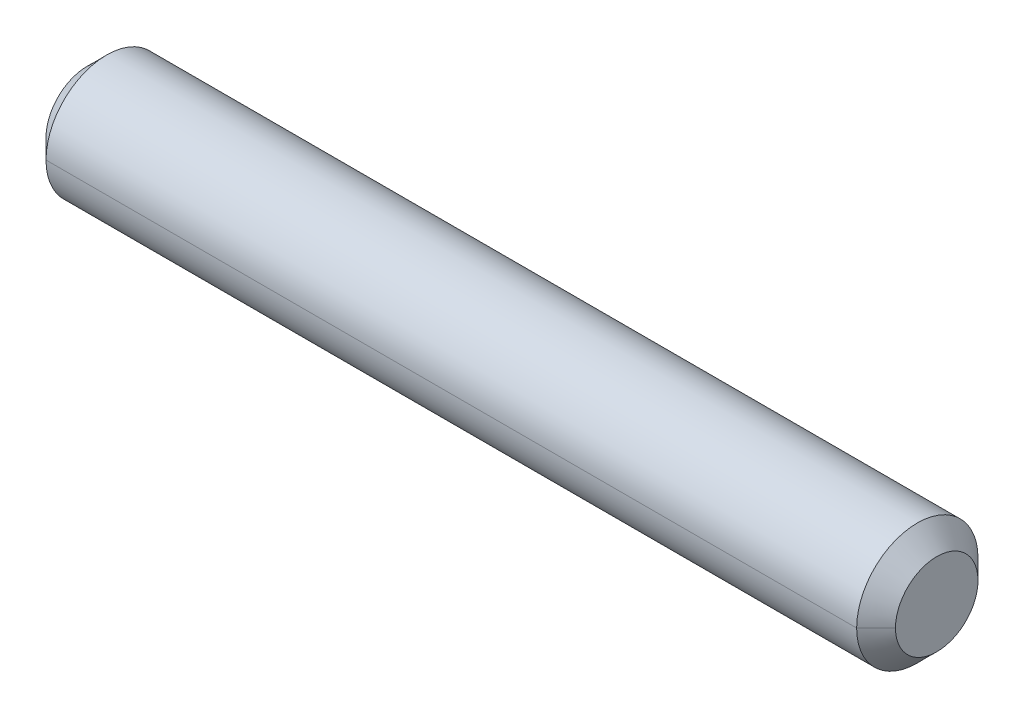
ISO-10303-21;
HEADER;
FILE_DESCRIPTION(('STEP AP214'),'2;1');
FILE_NAME('part.step','',(''),(''),'','','');
FILE_SCHEMA(('AUTOMOTIVE_DESIGN { 1 0 10303 214 1 1 1 1 }'));
ENDSEC;
DATA;
#1=APPLICATION_CONTEXT('core data for automotive mechanical design processes');
#2=APPLICATION_PROTOCOL_DEFINITION('international standard','automotive_design',2000,#1);
#3=PRODUCT_CONTEXT('',#1,'mechanical');
#4=PRODUCT('Part','Part','',(#3));
#5=PRODUCT_RELATED_PRODUCT_CATEGORY('part','',(#4));
#6=PRODUCT_DEFINITION_FORMATION('','',#4);
#7=PRODUCT_DEFINITION_CONTEXT('part definition',#1,'design');
#8=PRODUCT_DEFINITION('design','',#6,#7);
#9=PRODUCT_DEFINITION_SHAPE('','',#8);
#10=(LENGTH_UNIT() NAMED_UNIT(*) SI_UNIT(.MILLI.,.METRE.));
#11=(NAMED_UNIT(*) PLANE_ANGLE_UNIT() SI_UNIT($,.RADIAN.));
#12=(NAMED_UNIT(*) SI_UNIT($,.STERADIAN.) SOLID_ANGLE_UNIT());
#13=UNCERTAINTY_MEASURE_WITH_UNIT(LENGTH_MEASURE(1.E-05),#10,'distance_accuracy_value','');
#14=(GEOMETRIC_REPRESENTATION_CONTEXT(3) GLOBAL_UNCERTAINTY_ASSIGNED_CONTEXT((#13)) GLOBAL_UNIT_ASSIGNED_CONTEXT((#10,
#11,#12)) REPRESENTATION_CONTEXT('',''));
#15=CARTESIAN_POINT('',(0.,0.,0.));
#16=DIRECTION('',(0.,0.,1.));
#17=DIRECTION('',(1.,0.,0.));
#18=AXIS2_PLACEMENT_3D('',#15,#16,#17);
#19=CARTESIAN_POINT('',(17.5,0.,0.));
#20=DIRECTION('',(-1.,0.,0.));
#21=DIRECTION('',(0.,0.,1.));
#22=AXIS2_PLACEMENT_3D('',#19,#20,#21);
#23=CONICAL_SURFACE('',#22,1.7,0.785398163397445);
#24=DIRECTION('',(-0.70710678118655,0.,-0.707106781186545));
#25=VECTOR('',#24,1.);
#26=CARTESIAN_POINT('',(17.5,0.,-1.7));
#27=LINE('',#26,#25);
#28=CARTESIAN_POINT('',(17.5,0.,-1.7));
#29=VERTEX_POINT('',#28);
#30=CARTESIAN_POINT('',(16.7,0.,-2.5));
#31=VERTEX_POINT('',#30);
#32=EDGE_CURVE('E84',#29,#31,#27,.T.);
#33=ORIENTED_EDGE('',*,*,#32,.F.);
#34=CARTESIAN_POINT('',(17.5,0.,0.));
#35=DIRECTION('',(1.,0.,0.));
#36=DIRECTION('',(0.,0.,-1.));
#37=AXIS2_PLACEMENT_3D('',#34,#35,#36);
#38=CIRCLE('',#37,1.7);
#39=CARTESIAN_POINT('',(17.5,0.,1.7));
#40=VERTEX_POINT('',#39);
#41=EDGE_CURVE('E27',#40,#29,#38,.T.);
#42=ORIENTED_EDGE('',*,*,#41,.F.);
#43=DIRECTION('',(-0.70710678118655,0.,0.707106781186545));
#44=VECTOR('',#43,1.);
#45=CARTESIAN_POINT('',(17.5,0.,1.7));
#46=LINE('',#45,#44);
#47=CARTESIAN_POINT('',(16.7,0.,2.5));
#48=VERTEX_POINT('',#47);
#49=EDGE_CURVE('E91',#40,#48,#46,.T.);
#50=ORIENTED_EDGE('',*,*,#49,.T.);
#51=CARTESIAN_POINT('',(16.7,0.,0.));
#52=DIRECTION('',(-1.,0.,0.));
#53=DIRECTION('',(0.,0.,-1.));
#54=AXIS2_PLACEMENT_3D('',#51,#52,#53);
#55=CIRCLE('',#54,2.5);
#56=EDGE_CURVE('E20',#31,#48,#55,.T.);
#57=ORIENTED_EDGE('',*,*,#56,.F.);
#58=EDGE_LOOP('',(#33,#42,#50,#57));
#59=FACE_BOUND('',#58,.T.);
#60=ADVANCED_FACE('F17',(#59),#23,.T.);
#61=CARTESIAN_POINT('',(-16.7,0.,0.));
#62=DIRECTION('',(1.,0.,0.));
#63=DIRECTION('',(0.,0.,-1.));
#64=AXIS2_PLACEMENT_3D('',#61,#62,#63);
#65=CONICAL_SURFACE('',#64,2.5,0.785398163397449);
#66=DIRECTION('',(0.707106781186547,0.,0.707106781186548));
#67=VECTOR('',#66,1.);
#68=CARTESIAN_POINT('',(-16.7,0.,2.5));
#69=LINE('',#68,#67);
#70=CARTESIAN_POINT('',(-17.5,0.,1.7));
#71=VERTEX_POINT('',#70);
#72=CARTESIAN_POINT('',(-16.7,0.,2.5));
#73=VERTEX_POINT('',#72);
#74=EDGE_CURVE('E117',#71,#73,#69,.T.);
#75=ORIENTED_EDGE('',*,*,#74,.F.);
#76=CARTESIAN_POINT('',(-17.5,0.,0.));
#77=DIRECTION('',(-1.,0.,0.));
#78=DIRECTION('',(0.,0.,-1.));
#79=AXIS2_PLACEMENT_3D('',#76,#77,#78);
#80=CIRCLE('',#79,1.7);
#81=CARTESIAN_POINT('',(-17.5,0.,-1.7));
#82=VERTEX_POINT('',#81);
#83=EDGE_CURVE('E11',#82,#71,#80,.T.);
#84=ORIENTED_EDGE('',*,*,#83,.F.);
#85=DIRECTION('',(0.707106781186547,0.,-0.707106781186548));
#86=VECTOR('',#85,1.);
#87=CARTESIAN_POINT('',(-16.7,0.,-2.5));
#88=LINE('',#87,#86);
#89=CARTESIAN_POINT('',(-16.7,0.,-2.5));
#90=VERTEX_POINT('',#89);
#91=EDGE_CURVE('E102',#82,#90,#88,.T.);
#92=ORIENTED_EDGE('',*,*,#91,.T.);
#93=CARTESIAN_POINT('',(-16.7,0.,0.));
#94=DIRECTION('',(1.,0.,0.));
#95=DIRECTION('',(0.,0.,-1.));
#96=AXIS2_PLACEMENT_3D('',#93,#94,#95);
#97=CIRCLE('',#96,2.5);
#98=EDGE_CURVE('E42',#73,#90,#97,.T.);
#99=ORIENTED_EDGE('',*,*,#98,.F.);
#100=EDGE_LOOP('',(#75,#84,#92,#99));
#101=FACE_BOUND('',#100,.T.);
#102=ADVANCED_FACE('F141',(#101),#65,.T.);
#103=CARTESIAN_POINT('',(-17.5,0.,0.));
#104=DIRECTION('',(1.,0.,0.));
#105=DIRECTION('',(0.,1.,0.));
#106=AXIS2_PLACEMENT_3D('',#103,#104,#105);
#107=PLANE('',#106);
#108=ORIENTED_EDGE('',*,*,#83,.T.);
#109=CARTESIAN_POINT('',(-17.5,0.,0.));
#110=DIRECTION('',(-1.,0.,0.));
#111=DIRECTION('',(0.,0.,-1.));
#112=AXIS2_PLACEMENT_3D('',#109,#110,#111);
#113=CIRCLE('',#112,1.7);
#114=EDGE_CURVE('E111',#71,#82,#113,.T.);
#115=ORIENTED_EDGE('',*,*,#114,.T.);
#116=EDGE_LOOP('',(#108,#115));
#117=FACE_BOUND('',#116,.T.);
#118=ADVANCED_FACE('F201',(#117),#107,.F.);
#119=CARTESIAN_POINT('',(17.5,0.,0.));
#120=DIRECTION('',(1.,0.,0.));
#121=DIRECTION('',(0.,1.,0.));
#122=AXIS2_PLACEMENT_3D('',#119,#120,#121);
#123=PLANE('',#122);
#124=ORIENTED_EDGE('',*,*,#41,.T.);
#125=CARTESIAN_POINT('',(17.5,0.,0.));
#126=DIRECTION('',(1.,0.,0.));
#127=DIRECTION('',(0.,0.,-1.));
#128=AXIS2_PLACEMENT_3D('',#125,#126,#127);
#129=CIRCLE('',#128,1.7);
#130=EDGE_CURVE('E80',#29,#40,#129,.T.);
#131=ORIENTED_EDGE('',*,*,#130,.T.);
#132=EDGE_LOOP('',(#124,#131));
#133=FACE_BOUND('',#132,.T.);
#134=ADVANCED_FACE('F78',(#133),#123,.T.);
#135=CARTESIAN_POINT('',(17.5,0.,0.));
#136=DIRECTION('',(-1.,0.,0.));
#137=DIRECTION('',(0.,0.,1.));
#138=AXIS2_PLACEMENT_3D('',#135,#136,#137);
#139=CYLINDRICAL_SURFACE('',#138,2.5);
#140=DIRECTION('',(-1.,0.,0.));
#141=VECTOR('',#140,1.);
#142=CARTESIAN_POINT('',(17.5,0.,-2.5));
#143=LINE('',#142,#141);
#144=EDGE_CURVE('E98',#31,#90,#143,.T.);
#145=ORIENTED_EDGE('',*,*,#144,.F.);
#146=ORIENTED_EDGE('',*,*,#56,.T.);
#147=DIRECTION('',(-1.,0.,0.));
#148=VECTOR('',#147,1.);
#149=CARTESIAN_POINT('',(17.5,0.,2.5));
#150=LINE('',#149,#148);
#151=EDGE_CURVE('E101',#48,#73,#150,.T.);
#152=ORIENTED_EDGE('',*,*,#151,.T.);
#153=ORIENTED_EDGE('',*,*,#98,.T.);
#154=EDGE_LOOP('',(#145,#146,#152,#153));
#155=FACE_BOUND('',#154,.T.);
#156=ADVANCED_FACE('F142',(#155),#139,.T.);
#157=CARTESIAN_POINT('',(17.5,0.,0.));
#158=DIRECTION('',(-1.,0.,0.));
#159=DIRECTION('',(0.,0.,1.));
#160=AXIS2_PLACEMENT_3D('',#157,#158,#159);
#161=CYLINDRICAL_SURFACE('',#160,2.5);
#162=CARTESIAN_POINT('',(16.7,0.,0.));
#163=DIRECTION('',(-1.,0.,0.));
#164=DIRECTION('',(0.,0.,-1.));
#165=AXIS2_PLACEMENT_3D('',#162,#163,#164);
#166=CIRCLE('',#165,2.5);
#167=EDGE_CURVE('E88',#48,#31,#166,.T.);
#168=ORIENTED_EDGE('',*,*,#167,.T.);
#169=ORIENTED_EDGE('',*,*,#144,.T.);
#170=CARTESIAN_POINT('',(-16.7,0.,0.));
#171=DIRECTION('',(1.,0.,0.));
#172=DIRECTION('',(0.,0.,-1.));
#173=AXIS2_PLACEMENT_3D('',#170,#171,#172);
#174=CIRCLE('',#173,2.5);
#175=EDGE_CURVE('E109',#90,#73,#174,.T.);
#176=ORIENTED_EDGE('',*,*,#175,.T.);
#177=ORIENTED_EDGE('',*,*,#151,.F.);
#178=EDGE_LOOP('',(#168,#169,#176,#177));
#179=FACE_BOUND('',#178,.T.);
#180=ADVANCED_FACE('F134',(#179),#161,.T.);
#181=CARTESIAN_POINT('',(-16.7,0.,0.));
#182=DIRECTION('',(1.,0.,0.));
#183=DIRECTION('',(0.,0.,-1.));
#184=AXIS2_PLACEMENT_3D('',#181,#182,#183);
#185=CONICAL_SURFACE('',#184,2.5,0.785398163397449);
#186=ORIENTED_EDGE('',*,*,#114,.F.);
#187=ORIENTED_EDGE('',*,*,#74,.T.);
#188=ORIENTED_EDGE('',*,*,#175,.F.);
#189=ORIENTED_EDGE('',*,*,#91,.F.);
#190=EDGE_LOOP('',(#186,#187,#188,#189));
#191=FACE_BOUND('',#190,.T.);
#192=ADVANCED_FACE('F139',(#191),#185,.T.);
#193=CARTESIAN_POINT('',(17.5,0.,0.));
#194=DIRECTION('',(-1.,0.,0.));
#195=DIRECTION('',(0.,0.,1.));
#196=AXIS2_PLACEMENT_3D('',#193,#194,#195);
#197=CONICAL_SURFACE('',#196,1.7,0.785398163397445);
#198=ORIENTED_EDGE('',*,*,#130,.F.);
#199=ORIENTED_EDGE('',*,*,#32,.T.);
#200=ORIENTED_EDGE('',*,*,#167,.F.);
#201=ORIENTED_EDGE('',*,*,#49,.F.);
#202=EDGE_LOOP('',(#198,#199,#200,#201));
#203=FACE_BOUND('',#202,.T.);
#204=ADVANCED_FACE('F90',(#203),#197,.T.);
#205=CLOSED_SHELL('',(#60,#102,#118,#134,#156,#180,#192,#204));
#206=MANIFOLD_SOLID_BREP('B1',#205);
#207=ADVANCED_BREP_SHAPE_REPRESENTATION('',(#18,#206),#14);
#208=SHAPE_DEFINITION_REPRESENTATION(#9,#207);
ENDSEC;
END-ISO-10303-21;
